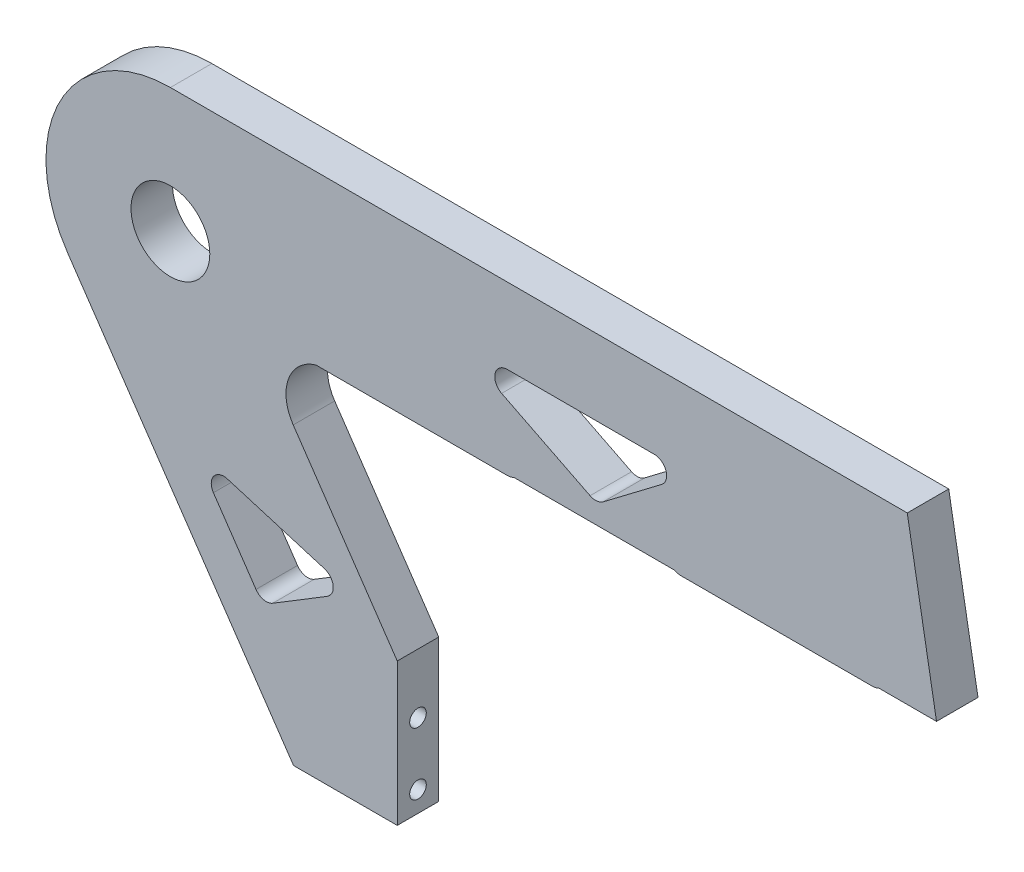
ISO-10303-21;
HEADER;
FILE_DESCRIPTION(('STEP AP214'),'2;1');
FILE_NAME('part.step','',(''),(''),'','','');
FILE_SCHEMA(('AUTOMOTIVE_DESIGN { 1 0 10303 214 1 1 1 1 }'));
ENDSEC;
DATA;
#1=APPLICATION_CONTEXT('core data for automotive mechanical design processes');
#2=APPLICATION_PROTOCOL_DEFINITION('international standard','automotive_design',2000,#1);
#3=PRODUCT_CONTEXT('',#1,'mechanical');
#4=PRODUCT('Part','Part','',(#3));
#5=PRODUCT_RELATED_PRODUCT_CATEGORY('part','',(#4));
#6=PRODUCT_DEFINITION_FORMATION('','',#4);
#7=PRODUCT_DEFINITION_CONTEXT('part definition',#1,'design');
#8=PRODUCT_DEFINITION('design','',#6,#7);
#9=PRODUCT_DEFINITION_SHAPE('','',#8);
#10=(LENGTH_UNIT() NAMED_UNIT(*) SI_UNIT(.MILLI.,.METRE.));
#11=(NAMED_UNIT(*) PLANE_ANGLE_UNIT() SI_UNIT($,.RADIAN.));
#12=(NAMED_UNIT(*) SI_UNIT($,.STERADIAN.) SOLID_ANGLE_UNIT());
#13=UNCERTAINTY_MEASURE_WITH_UNIT(LENGTH_MEASURE(1.E-05),#10,'distance_accuracy_value','');
#14=(GEOMETRIC_REPRESENTATION_CONTEXT(3) GLOBAL_UNCERTAINTY_ASSIGNED_CONTEXT((#13)) GLOBAL_UNIT_ASSIGNED_CONTEXT((#10,
#11,#12)) REPRESENTATION_CONTEXT('',''));
#15=CARTESIAN_POINT('',(0.,0.,0.));
#16=DIRECTION('',(0.,0.,1.));
#17=DIRECTION('',(1.,0.,0.));
#18=AXIS2_PLACEMENT_3D('',#15,#16,#17);
#19=CARTESIAN_POINT('',(26.6047172545659,86.3252414042962,5.));
#20=DIRECTION('',(0.,-1.,0.));
#21=DIRECTION('',(0.,0.,-1.));
#22=AXIS2_PLACEMENT_3D('',#19,#20,#21);
#23=PLANE('',#22);
#24=DIRECTION('',(-1.,0.,0.));
#25=VECTOR('',#24,1.);
#26=CARTESIAN_POINT('',(26.6047172545659,86.3252414042962,5.));
#27=LINE('',#26,#25);
#28=CARTESIAN_POINT('',(26.6047172545659,86.3252414042962,5.));
#29=VERTEX_POINT('',#28);
#30=CARTESIAN_POINT('',(-19.5793225067377,86.3252414042962,5.));
#31=VERTEX_POINT('',#30);
#32=EDGE_CURVE('E570',#29,#31,#27,.T.);
#33=ORIENTED_EDGE('',*,*,#32,.T.);
#34=DIRECTION('',(0.,0.,-1.));
#35=VECTOR('',#34,1.);
#36=CARTESIAN_POINT('',(-19.5793225067377,86.3252414042962,5.));
#37=LINE('',#36,#35);
#38=CARTESIAN_POINT('',(-19.5793225067377,86.3252414042962,-5.));
#39=VERTEX_POINT('',#38);
#40=EDGE_CURVE('E12',#31,#39,#37,.T.);
#41=ORIENTED_EDGE('',*,*,#40,.T.);
#42=DIRECTION('',(-1.,0.,0.));
#43=VECTOR('',#42,1.);
#44=CARTESIAN_POINT('',(26.6047172545659,86.3252414042962,-5.));
#45=LINE('',#44,#43);
#46=CARTESIAN_POINT('',(26.6047172545659,86.3252414042962,-5.));
#47=VERTEX_POINT('',#46);
#48=EDGE_CURVE('E337',#47,#39,#45,.T.);
#49=ORIENTED_EDGE('',*,*,#48,.F.);
#50=DIRECTION('',(0.,0.,-1.));
#51=VECTOR('',#50,1.);
#52=CARTESIAN_POINT('',(26.6047172545659,86.3252414042962,5.));
#53=LINE('',#52,#51);
#54=EDGE_CURVE('E395',#29,#47,#53,.T.);
#55=ORIENTED_EDGE('',*,*,#54,.F.);
#56=EDGE_LOOP('',(#33,#41,#49,#55));
#57=FACE_BOUND('',#56,.T.);
#58=ADVANCED_FACE('F280',(#57),#23,.T.);
#59=CARTESIAN_POINT('',(26.6047172545659,89.3252414042961,5.));
#60=DIRECTION('',(0.,0.,-1.));
#61=DIRECTION('',(-1.,0.,0.));
#62=AXIS2_PLACEMENT_3D('',#59,#60,#61);
#63=CYLINDRICAL_SURFACE('',#62,2.99999999999997);
#64=CARTESIAN_POINT('',(26.6047172545659,89.3252414042961,-5.));
#65=DIRECTION('',(0.,0.,-1.));
#66=DIRECTION('',(-1.,0.,0.));
#67=AXIS2_PLACEMENT_3D('',#64,#65,#66);
#68=CIRCLE('',#67,2.99999999999997);
#69=CARTESIAN_POINT('',(28.0795884291685,86.7128181961757,-5.));
#70=VERTEX_POINT('',#69);
#71=EDGE_CURVE('E573',#70,#47,#68,.T.);
#72=ORIENTED_EDGE('',*,*,#71,.F.);
#73=DIRECTION('',(0.,0.,-1.));
#74=VECTOR('',#73,1.);
#75=CARTESIAN_POINT('',(28.0795884291685,86.7128181961757,5.));
#76=LINE('',#75,#74);
#77=CARTESIAN_POINT('',(28.0795884291685,86.7128181961757,5.));
#78=VERTEX_POINT('',#77);
#79=EDGE_CURVE('E290',#70,#78,#76,.F.);
#80=ORIENTED_EDGE('',*,*,#79,.T.);
#81=CARTESIAN_POINT('',(26.6047172545659,89.3252414042961,5.));
#82=DIRECTION('',(0.,0.,-1.));
#83=DIRECTION('',(-1.,0.,0.));
#84=AXIS2_PLACEMENT_3D('',#81,#82,#83);
#85=CIRCLE('',#84,2.99999999999997);
#86=EDGE_CURVE('E572',#78,#29,#85,.T.);
#87=ORIENTED_EDGE('',*,*,#86,.T.);
#88=ORIENTED_EDGE('',*,*,#54,.T.);
#89=EDGE_LOOP('',(#72,#80,#87,#88));
#90=FACE_BOUND('',#89,.T.);
#91=ADVANCED_FACE('F734',(#90),#63,.T.);
#92=CARTESIAN_POINT('',(114.623497212367,86.3252414042962,5.));
#93=DIRECTION('',(0.,-1.,0.));
#94=DIRECTION('',(0.,0.,-1.));
#95=AXIS2_PLACEMENT_3D('',#92,#93,#94);
#96=PLANE('',#95);
#97=DIRECTION('',(-1.,0.,0.));
#98=VECTOR('',#97,1.);
#99=CARTESIAN_POINT('',(114.623497212367,86.3252414042962,-5.));
#100=LINE('',#99,#98);
#101=CARTESIAN_POINT('',(114.623497212367,86.3252414042962,-5.));
#102=VERTEX_POINT('',#101);
#103=CARTESIAN_POINT('',(68.3535915441412,86.3252414042962,-5.));
#104=VERTEX_POINT('',#103);
#105=EDGE_CURVE('E331',#102,#104,#100,.T.);
#106=ORIENTED_EDGE('',*,*,#105,.F.);
#107=DIRECTION('',(0.,0.,-1.));
#108=VECTOR('',#107,1.);
#109=CARTESIAN_POINT('',(114.623497212367,86.3252414042962,5.));
#110=LINE('',#109,#108);
#111=CARTESIAN_POINT('',(114.623497212367,86.3252414042962,5.));
#112=VERTEX_POINT('',#111);
#113=EDGE_CURVE('E338',#112,#102,#110,.T.);
#114=ORIENTED_EDGE('',*,*,#113,.F.);
#115=DIRECTION('',(-1.,0.,0.));
#116=VECTOR('',#115,1.);
#117=CARTESIAN_POINT('',(114.623497212367,86.3252414042962,5.));
#118=LINE('',#117,#116);
#119=CARTESIAN_POINT('',(68.3535915441412,86.3252414042962,5.));
#120=VERTEX_POINT('',#119);
#121=EDGE_CURVE('E333',#112,#120,#118,.T.);
#122=ORIENTED_EDGE('',*,*,#121,.T.);
#123=DIRECTION('',(0.,0.,-1.));
#124=VECTOR('',#123,1.);
#125=CARTESIAN_POINT('',(68.3535915441412,86.3252414042962,5.));
#126=LINE('',#125,#124);
#127=EDGE_CURVE('E327',#120,#104,#126,.T.);
#128=ORIENTED_EDGE('',*,*,#127,.T.);
#129=EDGE_LOOP('',(#106,#114,#122,#128));
#130=FACE_BOUND('',#129,.T.);
#131=ADVANCED_FACE('F329',(#130),#96,.T.);
#132=CARTESIAN_POINT('',(114.623497212367,89.3252414042962,5.));
#133=DIRECTION('',(0.,0.,-1.));
#134=DIRECTION('',(-1.,0.,0.));
#135=AXIS2_PLACEMENT_3D('',#132,#133,#134);
#136=CYLINDRICAL_SURFACE('',#135,3.);
#137=CARTESIAN_POINT('',(114.623497212367,89.3252414042962,-5.));
#138=DIRECTION('',(0.,0.,-1.));
#139=DIRECTION('',(-1.,0.,0.));
#140=AXIS2_PLACEMENT_3D('',#137,#138,#139);
#141=CIRCLE('',#140,3.);
#142=CARTESIAN_POINT('',(116.09836838697,86.7128181961757,-5.));
#143=VERTEX_POINT('',#142);
#144=EDGE_CURVE('E321',#143,#102,#141,.T.);
#145=ORIENTED_EDGE('',*,*,#144,.F.);
#146=DIRECTION('',(0.,0.,-1.));
#147=VECTOR('',#146,1.);
#148=CARTESIAN_POINT('',(116.09836838697,86.7128181961757,5.));
#149=LINE('',#148,#147);
#150=CARTESIAN_POINT('',(116.09836838697,86.7128181961757,5.));
#151=VERTEX_POINT('',#150);
#152=EDGE_CURVE('E544',#143,#151,#149,.F.);
#153=ORIENTED_EDGE('',*,*,#152,.T.);
#154=CARTESIAN_POINT('',(114.623497212367,89.3252414042962,5.));
#155=DIRECTION('',(0.,0.,-1.));
#156=DIRECTION('',(-1.,0.,0.));
#157=AXIS2_PLACEMENT_3D('',#154,#155,#156);
#158=CIRCLE('',#157,3.);
#159=EDGE_CURVE('E354',#151,#112,#158,.T.);
#160=ORIENTED_EDGE('',*,*,#159,.T.);
#161=ORIENTED_EDGE('',*,*,#113,.T.);
#162=EDGE_LOOP('',(#145,#153,#160,#161));
#163=FACE_BOUND('',#162,.T.);
#164=ADVANCED_FACE('F583',(#163),#136,.T.);
#165=CARTESIAN_POINT('',(68.3535915441412,89.3252414042962,5.));
#166=DIRECTION('',(0.,0.,-1.));
#167=DIRECTION('',(-1.,0.,0.));
#168=AXIS2_PLACEMENT_3D('',#165,#166,#167);
#169=CYLINDRICAL_SURFACE('',#168,3.);
#170=CARTESIAN_POINT('',(68.3535915441412,89.3252414042962,5.));
#171=DIRECTION('',(0.,0.,-1.));
#172=DIRECTION('',(-1.,0.,0.));
#173=AXIS2_PLACEMENT_3D('',#170,#171,#172);
#174=CIRCLE('',#173,3.);
#175=CARTESIAN_POINT('',(66.8787203695385,86.7128181961757,5.));
#176=VERTEX_POINT('',#175);
#177=EDGE_CURVE('E352',#120,#176,#174,.T.);
#178=ORIENTED_EDGE('',*,*,#177,.T.);
#179=DIRECTION('',(0.,0.,-1.));
#180=VECTOR('',#179,1.);
#181=CARTESIAN_POINT('',(66.8787203695385,86.7128181961757,5.));
#182=LINE('',#181,#180);
#183=CARTESIAN_POINT('',(66.8787203695385,86.7128181961757,-5.));
#184=VERTEX_POINT('',#183);
#185=EDGE_CURVE('E345',#176,#184,#182,.T.);
#186=ORIENTED_EDGE('',*,*,#185,.T.);
#187=CARTESIAN_POINT('',(68.3535915441412,89.3252414042962,-5.));
#188=DIRECTION('',(0.,0.,-1.));
#189=DIRECTION('',(-1.,0.,0.));
#190=AXIS2_PLACEMENT_3D('',#187,#188,#189);
#191=CIRCLE('',#190,3.);
#192=EDGE_CURVE('E342',#104,#184,#191,.T.);
#193=ORIENTED_EDGE('',*,*,#192,.F.);
#194=ORIENTED_EDGE('',*,*,#127,.F.);
#195=EDGE_LOOP('',(#178,#186,#193,#194));
#196=FACE_BOUND('',#195,.T.);
#197=ADVANCED_FACE('F282',(#196),#169,.T.);
#198=CARTESIAN_POINT('',(-31.570335154587,33.9417913308013,5.));
#199=DIRECTION('',(0.,0.,-1.));
#200=DIRECTION('',(-1.,0.,0.));
#201=AXIS2_PLACEMENT_3D('',#198,#199,#200);
#202=CYLINDRICAL_SURFACE('',#201,2.99999999999999);
#203=CARTESIAN_POINT('',(-31.570335154587,33.9417913308013,-5.));
#204=DIRECTION('',(0.,0.,1.));
#205=DIRECTION('',(1.,0.,0.));
#206=AXIS2_PLACEMENT_3D('',#203,#204,#205);
#207=CIRCLE('',#206,2.99999999999999);
#208=CARTESIAN_POINT('',(-34.04820636073,32.2505922633443,-5.));
#209=VERTEX_POINT('',#208);
#210=CARTESIAN_POINT('',(-30.0092889753777,31.3799297368865,-5.));
#211=VERTEX_POINT('',#210);
#212=EDGE_CURVE('E458',#209,#211,#207,.T.);
#213=ORIENTED_EDGE('',*,*,#212,.F.);
#214=DIRECTION('',(0.,0.,-1.));
#215=VECTOR('',#214,1.);
#216=CARTESIAN_POINT('',(-34.04820636073,32.2505922633443,5.));
#217=LINE('',#216,#215);
#218=CARTESIAN_POINT('',(-34.04820636073,32.2505922633443,5.));
#219=VERTEX_POINT('',#218);
#220=EDGE_CURVE('E468',#219,#209,#217,.T.);
#221=ORIENTED_EDGE('',*,*,#220,.F.);
#222=CARTESIAN_POINT('',(-31.570335154587,33.9417913308013,5.));
#223=DIRECTION('',(0.,0.,1.));
#224=DIRECTION('',(1.,0.,0.));
#225=AXIS2_PLACEMENT_3D('',#222,#223,#224);
#226=CIRCLE('',#225,2.99999999999999);
#227=CARTESIAN_POINT('',(-30.0092889753777,31.3799297368865,5.));
#228=VERTEX_POINT('',#227);
#229=EDGE_CURVE('E440',#219,#228,#226,.T.);
#230=ORIENTED_EDGE('',*,*,#229,.T.);
#231=DIRECTION('',(0.,0.,-1.));
#232=VECTOR('',#231,1.);
#233=CARTESIAN_POINT('',(-30.0092889753777,31.3799297368865,5.));
#234=LINE('',#233,#232);
#235=EDGE_CURVE('E465',#228,#211,#234,.T.);
#236=ORIENTED_EDGE('',*,*,#235,.T.);
#237=EDGE_LOOP('',(#213,#221,#230,#236));
#238=FACE_BOUND('',#237,.T.);
#239=ADVANCED_FACE('F749',(#238),#202,.F.);
#240=CARTESIAN_POINT('',(-44.3201361267429,47.3005763181477,5.));
#241=DIRECTION('',(0.825957068714329,0.563733022485675,0.));
#242=DIRECTION('',(-0.563733022485675,0.825957068714329,0.));
#243=AXIS2_PLACEMENT_3D('',#240,#241,#242);
#244=PLANE('',#243);
#245=DIRECTION('',(0.563733022485675,-0.825957068714329,0.));
#246=VECTOR('',#245,1.);
#247=CARTESIAN_POINT('',(-44.3201361267429,47.3005763181477,-5.));
#248=LINE('',#247,#246);
#249=CARTESIAN_POINT('',(-44.3201361267429,47.3005763181477,-5.));
#250=VERTEX_POINT('',#249);
#251=EDGE_CURVE('E455',#250,#209,#248,.T.);
#252=ORIENTED_EDGE('',*,*,#251,.F.);
#253=DIRECTION('',(0.,0.,-1.));
#254=VECTOR('',#253,1.);
#255=CARTESIAN_POINT('',(-44.3201361267429,47.3005763181477,5.));
#256=LINE('',#255,#254);
#257=CARTESIAN_POINT('',(-44.3201361267429,47.3005763181477,5.));
#258=VERTEX_POINT('',#257);
#259=EDGE_CURVE('E471',#258,#250,#256,.T.);
#260=ORIENTED_EDGE('',*,*,#259,.F.);
#261=DIRECTION('',(0.563733022485675,-0.825957068714329,0.));
#262=VECTOR('',#261,1.);
#263=CARTESIAN_POINT('',(-44.3201361267429,47.3005763181477,5.));
#264=LINE('',#263,#262);
#265=EDGE_CURVE('E437',#258,#219,#264,.T.);
#266=ORIENTED_EDGE('',*,*,#265,.T.);
#267=ORIENTED_EDGE('',*,*,#220,.T.);
#268=EDGE_LOOP('',(#252,#260,#266,#267));
#269=FACE_BOUND('',#268,.T.);
#270=ADVANCED_FACE('F753',(#269),#244,.T.);
#271=CARTESIAN_POINT('',(-41.8422649206,48.9917753856047,5.));
#272=DIRECTION('',(0.,0.,-1.));
#273=DIRECTION('',(-1.,0.,0.));
#274=AXIS2_PLACEMENT_3D('',#271,#272,#273);
#275=CYLINDRICAL_SURFACE('',#274,2.99999999999999);
#276=CARTESIAN_POINT('',(-41.8422649206,48.9917753856047,-5.));
#277=DIRECTION('',(0.,0.,-1.));
#278=DIRECTION('',(-1.,0.,0.));
#279=AXIS2_PLACEMENT_3D('',#276,#277,#278);
#280=CIRCLE('',#279,2.99999999999999);
#281=CARTESIAN_POINT('',(-40.9783964877711,51.8647061767589,-5.));
#282=VERTEX_POINT('',#281);
#283=EDGE_CURVE('E452',#250,#282,#280,.T.);
#284=ORIENTED_EDGE('',*,*,#283,.T.);
#285=DIRECTION('',(0.,0.,-1.));
#286=VECTOR('',#285,1.);
#287=CARTESIAN_POINT('',(-40.9783964877711,51.8647061767589,5.));
#288=LINE('',#287,#286);
#289=CARTESIAN_POINT('',(-40.9783964877711,51.8647061767589,5.));
#290=VERTEX_POINT('',#289);
#291=EDGE_CURVE('E474',#290,#282,#288,.T.);
#292=ORIENTED_EDGE('',*,*,#291,.F.);
#293=CARTESIAN_POINT('',(-41.8422649206,48.9917753856047,5.));
#294=DIRECTION('',(0.,0.,-1.));
#295=DIRECTION('',(-1.,0.,0.));
#296=AXIS2_PLACEMENT_3D('',#293,#294,#295);
#297=CIRCLE('',#296,2.99999999999999);
#298=EDGE_CURVE('E434',#258,#290,#297,.T.);
#299=ORIENTED_EDGE('',*,*,#298,.F.);
#300=ORIENTED_EDGE('',*,*,#259,.T.);
#301=EDGE_LOOP('',(#284,#292,#299,#300));
#302=FACE_BOUND('',#301,.T.);
#303=ADVANCED_FACE('F759',(#302),#275,.F.);
#304=CARTESIAN_POINT('',(-17.562664750331,44.8237737805291,5.));
#305=DIRECTION('',(-0.287956144276289,-0.957643597051394,0.));
#306=DIRECTION('',(0.957643597051394,-0.287956144276289,0.));
#307=AXIS2_PLACEMENT_3D('',#304,#305,#306);
#308=PLANE('',#307);
#309=DIRECTION('',(-0.957643597051394,0.287956144276289,0.));
#310=VECTOR('',#309,1.);
#311=CARTESIAN_POINT('',(-17.562664750331,44.8237737805291,-5.));
#312=LINE('',#311,#310);
#313=CARTESIAN_POINT('',(-17.562664750331,44.8237737805291,-5.));
#314=VERTEX_POINT('',#313);
#315=EDGE_CURVE('E449',#314,#282,#312,.T.);
#316=ORIENTED_EDGE('',*,*,#315,.F.);
#317=DIRECTION('',(0.,0.,-1.));
#318=VECTOR('',#317,1.);
#319=CARTESIAN_POINT('',(-17.562664750331,44.8237737805291,5.));
#320=LINE('',#319,#318);
#321=CARTESIAN_POINT('',(-17.562664750331,44.8237737805291,5.));
#322=VERTEX_POINT('',#321);
#323=EDGE_CURVE('E477',#322,#314,#320,.T.);
#324=ORIENTED_EDGE('',*,*,#323,.F.);
#325=DIRECTION('',(-0.957643597051394,0.287956144276289,0.));
#326=VECTOR('',#325,1.);
#327=CARTESIAN_POINT('',(-17.562664750331,44.8237737805291,5.));
#328=LINE('',#327,#326);
#329=EDGE_CURVE('E430',#322,#290,#328,.T.);
#330=ORIENTED_EDGE('',*,*,#329,.T.);
#331=ORIENTED_EDGE('',*,*,#291,.T.);
#332=EDGE_LOOP('',(#316,#324,#330,#331));
#333=FACE_BOUND('',#332,.T.);
#334=ADVANCED_FACE('F769',(#333),#308,.T.);
#335=CARTESIAN_POINT('',(-18.4265331831598,41.9508429893749,5.));
#336=DIRECTION('',(0.,0.,-1.));
#337=DIRECTION('',(-1.,0.,0.));
#338=AXIS2_PLACEMENT_3D('',#335,#336,#337);
#339=CYLINDRICAL_SURFACE('',#338,2.99999999999999);
#340=CARTESIAN_POINT('',(-18.4265331831598,41.9508429893749,-5.));
#341=DIRECTION('',(0.,0.,1.));
#342=DIRECTION('',(1.,0.,0.));
#343=AXIS2_PLACEMENT_3D('',#340,#341,#342);
#344=CIRCLE('',#343,2.99999999999999);
#345=CARTESIAN_POINT('',(-16.8654870039506,39.3889813954601,-5.));
#346=VERTEX_POINT('',#345);
#347=EDGE_CURVE('E412',#346,#314,#344,.T.);
#348=ORIENTED_EDGE('',*,*,#347,.F.);
#349=DIRECTION('',(0.,0.,-1.));
#350=VECTOR('',#349,1.);
#351=CARTESIAN_POINT('',(-16.8654870039506,39.3889813954601,5.));
#352=LINE('',#351,#350);
#353=CARTESIAN_POINT('',(-16.8654870039506,39.3889813954601,5.));
#354=VERTEX_POINT('',#353);
#355=EDGE_CURVE('E446',#354,#346,#352,.T.);
#356=ORIENTED_EDGE('',*,*,#355,.F.);
#357=CARTESIAN_POINT('',(-18.4265331831598,41.9508429893749,5.));
#358=DIRECTION('',(0.,0.,1.));
#359=DIRECTION('',(1.,0.,0.));
#360=AXIS2_PLACEMENT_3D('',#357,#358,#359);
#361=CIRCLE('',#360,2.99999999999999);
#362=EDGE_CURVE('E427',#354,#322,#361,.T.);
#363=ORIENTED_EDGE('',*,*,#362,.T.);
#364=ORIENTED_EDGE('',*,*,#323,.T.);
#365=EDGE_LOOP('',(#348,#356,#363,#364));
#366=FACE_BOUND('',#365,.T.);
#367=ADVANCED_FACE('F773',(#366),#339,.F.);
#368=CARTESIAN_POINT('',(-30.0092889753777,31.3799297368865,5.));
#369=DIRECTION('',(-0.520348726403097,0.853953864638292,0.));
#370=DIRECTION('',(-0.853953864638292,-0.520348726403097,0.));
#371=AXIS2_PLACEMENT_3D('',#368,#369,#370);
#372=PLANE('',#371);
#373=DIRECTION('',(0.853953864638292,0.520348726403097,0.));
#374=VECTOR('',#373,1.);
#375=CARTESIAN_POINT('',(-30.0092889753777,31.3799297368865,-5.));
#376=LINE('',#375,#374);
#377=EDGE_CURVE('E431',#211,#346,#376,.T.);
#378=ORIENTED_EDGE('',*,*,#377,.F.);
#379=ORIENTED_EDGE('',*,*,#235,.F.);
#380=DIRECTION('',(0.853953864638292,0.520348726403097,0.));
#381=VECTOR('',#380,1.);
#382=CARTESIAN_POINT('',(-30.0092889753777,31.3799297368865,5.));
#383=LINE('',#382,#381);
#384=EDGE_CURVE('E443',#228,#354,#383,.T.);
#385=ORIENTED_EDGE('',*,*,#384,.T.);
#386=ORIENTED_EDGE('',*,*,#355,.T.);
#387=EDGE_LOOP('',(#378,#379,#385,#386));
#388=FACE_BOUND('',#387,.T.);
#389=ADVANCED_FACE('F764',(#388),#372,.T.);
#390=CARTESIAN_POINT('',(-54.6870264128926,96.7128181961757,5.));
#391=DIRECTION('',(0.,0.,-1.));
#392=DIRECTION('',(-1.,0.,0.));
#393=AXIS2_PLACEMENT_3D('',#390,#391,#392);
#394=CYLINDRICAL_SURFACE('',#393,9.50000000000001);
#395=CARTESIAN_POINT('',(-54.6870264128926,96.7128181961757,5.));
#396=DIRECTION('',(0.,0.,1.));
#397=DIRECTION('',(1.,0.,0.));
#398=AXIS2_PLACEMENT_3D('',#395,#396,#397);
#399=CIRCLE('',#398,9.50000000000001);
#400=CARTESIAN_POINT('',(-45.1870264128926,96.7128181961757,5.));
#401=VERTEX_POINT('',#400);
#402=EDGE_CURVE('E481',#401,#401,#399,.T.);
#403=ORIENTED_EDGE('',*,*,#402,.T.);
#404=EDGE_LOOP('',(#403));
#405=FACE_BOUND('',#404,.T.);
#406=CARTESIAN_POINT('',(-54.6870264128926,96.7128181961757,-5.));
#407=DIRECTION('',(0.,0.,1.));
#408=DIRECTION('',(1.,0.,0.));
#409=AXIS2_PLACEMENT_3D('',#406,#407,#408);
#410=CIRCLE('',#409,9.50000000000001);
#411=CARTESIAN_POINT('',(-45.1870264128926,96.7128181961757,-5.));
#412=VERTEX_POINT('',#411);
#413=EDGE_CURVE('E480',#412,#412,#410,.T.);
#414=ORIENTED_EDGE('',*,*,#413,.F.);
#415=EDGE_LOOP('',(#414));
#416=FACE_BOUND('',#415,.T.);
#417=ADVANCED_FACE('F778',(#405,#416),#394,.F.);
#418=CARTESIAN_POINT('',(46.4802926947495,92.0811795731184,5.));
#419=DIRECTION('',(-0.448484395141479,-0.893790661908359,0.));
#420=DIRECTION('',(0.893790661908359,-0.448484395141479,0.));
#421=AXIS2_PLACEMENT_3D('',#418,#419,#420);
#422=PLANE('',#421);
#423=DIRECTION('',(-0.893790661908359,0.448484395141479,0.));
#424=VECTOR('',#423,1.);
#425=CARTESIAN_POINT('',(46.4802926947495,92.0811795731184,-5.));
#426=LINE('',#425,#424);
#427=CARTESIAN_POINT('',(46.4802926947495,92.0811795731184,-5.));
#428=VERTEX_POINT('',#427);
#429=CARTESIAN_POINT('',(25.1602319501235,102.77911473281,-5.));
#430=VERTEX_POINT('',#429);
#431=EDGE_CURVE('E394',#428,#430,#426,.T.);
#432=ORIENTED_EDGE('',*,*,#431,.T.);
#433=DIRECTION('',(0.,0.,-1.));
#434=VECTOR('',#433,1.);
#435=CARTESIAN_POINT('',(25.1602319501235,102.77911473281,5.));
#436=LINE('',#435,#434);
#437=CARTESIAN_POINT('',(25.1602319501235,102.77911473281,5.));
#438=VERTEX_POINT('',#437);
#439=EDGE_CURVE('E422',#438,#430,#436,.T.);
#440=ORIENTED_EDGE('',*,*,#439,.F.);
#441=DIRECTION('',(-0.893790661908359,0.448484395141479,0.));
#442=VECTOR('',#441,1.);
#443=CARTESIAN_POINT('',(46.4802926947495,92.0811795731184,5.));
#444=LINE('',#443,#442);
#445=CARTESIAN_POINT('',(46.4802926947495,92.0811795731184,5.));
#446=VERTEX_POINT('',#445);
#447=EDGE_CURVE('E374',#446,#438,#444,.T.);
#448=ORIENTED_EDGE('',*,*,#447,.F.);
#449=DIRECTION('',(0.,0.,-1.));
#450=VECTOR('',#449,1.);
#451=CARTESIAN_POINT('',(46.4802926947495,92.0811795731184,5.));
#452=LINE('',#451,#450);
#453=EDGE_CURVE('E390',#446,#428,#452,.T.);
#454=ORIENTED_EDGE('',*,*,#453,.T.);
#455=EDGE_LOOP('',(#432,#440,#448,#454));
#456=FACE_BOUND('',#455,.T.);
#457=ADVANCED_FACE('F706',(#456),#422,.F.);
#458=CARTESIAN_POINT('',(26.505685135548,105.460486718535,5.));
#459=DIRECTION('',(0.,0.,-1.));
#460=DIRECTION('',(-1.,0.,0.));
#461=AXIS2_PLACEMENT_3D('',#458,#459,#460);
#462=CYLINDRICAL_SURFACE('',#461,3.);
#463=CARTESIAN_POINT('',(26.505685135548,105.460486718535,-5.));
#464=DIRECTION('',(0.,0.,1.));
#465=DIRECTION('',(1.,0.,0.));
#466=AXIS2_PLACEMENT_3D('',#463,#464,#465);
#467=CIRCLE('',#466,3.);
#468=CARTESIAN_POINT('',(26.505685135548,108.460486718535,-5.));
#469=VERTEX_POINT('',#468);
#470=EDGE_CURVE('E398',#469,#430,#467,.T.);
#471=ORIENTED_EDGE('',*,*,#470,.F.);
#472=DIRECTION('',(0.,0.,-1.));
#473=VECTOR('',#472,1.);
#474=CARTESIAN_POINT('',(26.505685135548,108.460486718535,5.));
#475=LINE('',#474,#473);
#476=CARTESIAN_POINT('',(26.505685135548,108.460486718535,5.));
#477=VERTEX_POINT('',#476);
#478=EDGE_CURVE('E419',#477,#469,#475,.T.);
#479=ORIENTED_EDGE('',*,*,#478,.F.);
#480=CARTESIAN_POINT('',(26.505685135548,105.460486718535,5.));
#481=DIRECTION('',(0.,0.,1.));
#482=DIRECTION('',(1.,0.,0.));
#483=AXIS2_PLACEMENT_3D('',#480,#481,#482);
#484=CIRCLE('',#483,3.);
#485=EDGE_CURVE('E378',#477,#438,#484,.T.);
#486=ORIENTED_EDGE('',*,*,#485,.T.);
#487=ORIENTED_EDGE('',*,*,#439,.T.);
#488=EDGE_LOOP('',(#471,#479,#486,#487));
#489=FACE_BOUND('',#488,.T.);
#490=ADVANCED_FACE('F719',(#489),#462,.F.);
#491=CARTESIAN_POINT('',(26.505685135548,108.460486718535,5.));
#492=DIRECTION('',(0.,1.,0.));
#493=DIRECTION('',(0.,0.,1.));
#494=AXIS2_PLACEMENT_3D('',#491,#492,#493);
#495=PLANE('',#494);
#496=DIRECTION('',(1.,0.,0.));
#497=VECTOR('',#496,1.);
#498=CARTESIAN_POINT('',(26.505685135548,108.460486718535,-5.));
#499=LINE('',#498,#497);
#500=CARTESIAN_POINT('',(61.9454963051726,108.460486718535,-5.));
#501=VERTEX_POINT('',#500);
#502=EDGE_CURVE('E401',#469,#501,#499,.T.);
#503=ORIENTED_EDGE('',*,*,#502,.T.);
#504=DIRECTION('',(0.,0.,-1.));
#505=VECTOR('',#504,1.);
#506=CARTESIAN_POINT('',(61.9454963051726,108.460486718535,5.));
#507=LINE('',#506,#505);
#508=CARTESIAN_POINT('',(61.9454963051726,108.460486718535,5.));
#509=VERTEX_POINT('',#508);
#510=EDGE_CURVE('E416',#509,#501,#507,.T.);
#511=ORIENTED_EDGE('',*,*,#510,.F.);
#512=DIRECTION('',(1.,0.,0.));
#513=VECTOR('',#512,1.);
#514=CARTESIAN_POINT('',(26.505685135548,108.460486718535,5.));
#515=LINE('',#514,#513);
#516=EDGE_CURVE('E381',#477,#509,#515,.T.);
#517=ORIENTED_EDGE('',*,*,#516,.F.);
#518=ORIENTED_EDGE('',*,*,#478,.T.);
#519=EDGE_LOOP('',(#503,#511,#517,#518));
#520=FACE_BOUND('',#519,.T.);
#521=ADVANCED_FACE('F722',(#520),#495,.F.);
#522=CARTESIAN_POINT('',(61.9454963051726,105.460486718535,5.));
#523=DIRECTION('',(0.,0.,-1.));
#524=DIRECTION('',(-1.,0.,0.));
#525=AXIS2_PLACEMENT_3D('',#522,#523,#524);
#526=CYLINDRICAL_SURFACE('',#525,3.);
#527=CARTESIAN_POINT('',(61.9454963051726,105.460486718535,-5.));
#528=DIRECTION('',(0.,0.,-1.));
#529=DIRECTION('',(-1.,0.,0.));
#530=AXIS2_PLACEMENT_3D('',#527,#528,#529);
#531=CIRCLE('',#530,3.);
#532=CARTESIAN_POINT('',(63.7571935919196,103.069304387303,-5.));
#533=VERTEX_POINT('',#532);
#534=EDGE_CURVE('E404',#501,#533,#531,.T.);
#535=ORIENTED_EDGE('',*,*,#534,.T.);
#536=DIRECTION('',(0.,0.,-1.));
#537=VECTOR('',#536,1.);
#538=CARTESIAN_POINT('',(63.7571935919196,103.069304387303,5.));
#539=LINE('',#538,#537);
#540=CARTESIAN_POINT('',(63.7571935919196,103.069304387303,5.));
#541=VERTEX_POINT('',#540);
#542=EDGE_CURVE('E413',#541,#533,#539,.T.);
#543=ORIENTED_EDGE('',*,*,#542,.F.);
#544=CARTESIAN_POINT('',(61.9454963051726,105.460486718535,5.));
#545=DIRECTION('',(0.,0.,-1.));
#546=DIRECTION('',(-1.,0.,0.));
#547=AXIS2_PLACEMENT_3D('',#544,#545,#546);
#548=CIRCLE('',#547,3.);
#549=EDGE_CURVE('E384',#509,#541,#548,.T.);
#550=ORIENTED_EDGE('',*,*,#549,.F.);
#551=ORIENTED_EDGE('',*,*,#510,.T.);
#552=EDGE_LOOP('',(#535,#543,#550,#551));
#553=FACE_BOUND('',#552,.T.);
#554=ADVANCED_FACE('F724',(#553),#526,.F.);
#555=CARTESIAN_POINT('',(63.7571935919196,103.069304387303,5.));
#556=DIRECTION('',(0.603899095582316,-0.79706077707717,0.));
#557=DIRECTION('',(0.79706077707717,0.603899095582316,0.));
#558=AXIS2_PLACEMENT_3D('',#555,#556,#557);
#559=PLANE('',#558);
#560=DIRECTION('',(-0.797060777077169,-0.603899095582316,0.));
#561=VECTOR('',#560,1.);
#562=CARTESIAN_POINT('',(63.7571935919196,103.069304387303,-5.));
#563=LINE('',#562,#561);
#564=CARTESIAN_POINT('',(49.6374431669209,92.371369227612,-5.));
#565=VERTEX_POINT('',#564);
#566=EDGE_CURVE('E375',#533,#565,#563,.T.);
#567=ORIENTED_EDGE('',*,*,#566,.T.);
#568=DIRECTION('',(0.,0.,-1.));
#569=VECTOR('',#568,1.);
#570=CARTESIAN_POINT('',(49.6374431669209,92.371369227612,5.));
#571=LINE('',#570,#569);
#572=CARTESIAN_POINT('',(49.6374431669209,92.371369227612,5.));
#573=VERTEX_POINT('',#572);
#574=EDGE_CURVE('E409',#573,#565,#571,.T.);
#575=ORIENTED_EDGE('',*,*,#574,.F.);
#576=DIRECTION('',(-0.797060777077169,-0.603899095582316,0.));
#577=VECTOR('',#576,1.);
#578=CARTESIAN_POINT('',(63.7571935919196,103.069304387303,5.));
#579=LINE('',#578,#577);
#580=EDGE_CURVE('E387',#541,#573,#579,.T.);
#581=ORIENTED_EDGE('',*,*,#580,.F.);
#582=ORIENTED_EDGE('',*,*,#542,.T.);
#583=EDGE_LOOP('',(#567,#575,#581,#582));
#584=FACE_BOUND('',#583,.T.);
#585=ADVANCED_FACE('F712',(#584),#559,.F.);
#586=CARTESIAN_POINT('',(47.825745880174,94.7625515588435,5.));
#587=DIRECTION('',(0.,0.,-1.));
#588=DIRECTION('',(-1.,0.,0.));
#589=AXIS2_PLACEMENT_3D('',#586,#587,#588);
#590=CYLINDRICAL_SURFACE('',#589,3.00000000000001);
#591=CARTESIAN_POINT('',(47.825745880174,94.7625515588435,-5.));
#592=DIRECTION('',(0.,0.,-1.));
#593=DIRECTION('',(-1.,0.,0.));
#594=AXIS2_PLACEMENT_3D('',#591,#592,#593);
#595=CIRCLE('',#594,3.00000000000001);
#596=EDGE_CURVE('E391',#565,#428,#595,.T.);
#597=ORIENTED_EDGE('',*,*,#596,.T.);
#598=ORIENTED_EDGE('',*,*,#453,.F.);
#599=CARTESIAN_POINT('',(47.825745880174,94.7625515588435,5.));
#600=DIRECTION('',(0.,0.,-1.));
#601=DIRECTION('',(-1.,0.,0.));
#602=AXIS2_PLACEMENT_3D('',#599,#600,#601);
#603=CIRCLE('',#602,3.00000000000001);
#604=EDGE_CURVE('E371',#573,#446,#603,.T.);
#605=ORIENTED_EDGE('',*,*,#604,.F.);
#606=ORIENTED_EDGE('',*,*,#574,.T.);
#607=EDGE_LOOP('',(#597,#598,#605,#606));
#608=FACE_BOUND('',#607,.T.);
#609=ADVANCED_FACE('F702',(#608),#590,.F.);
#610=CARTESIAN_POINT('',(-54.6870264128926,126.712818196176,5.));
#611=DIRECTION('',(0.,1.,0.));
#612=DIRECTION('',(0.,0.,1.));
#613=AXIS2_PLACEMENT_3D('',#610,#611,#612);
#614=PLANE('',#613);
#615=DIRECTION('',(1.,0.,0.));
#616=VECTOR('',#615,1.);
#617=CARTESIAN_POINT('',(-54.6870264128926,126.712818196176,-5.));
#618=LINE('',#617,#616);
#619=CARTESIAN_POINT('',(-54.6870264128926,126.712818196176,-5.));
#620=VERTEX_POINT('',#619);
#621=CARTESIAN_POINT('',(122.946920771661,126.712818196176,-5.));
#622=VERTEX_POINT('',#621);
#623=EDGE_CURVE('E530',#620,#622,#618,.T.);
#624=ORIENTED_EDGE('',*,*,#623,.F.);
#625=DIRECTION('',(0.,0.,-1.));
#626=VECTOR('',#625,1.);
#627=CARTESIAN_POINT('',(-54.6870264128926,126.712818196176,5.));
#628=LINE('',#627,#626);
#629=CARTESIAN_POINT('',(-54.6870264128926,126.712818196176,5.));
#630=VERTEX_POINT('',#629);
#631=EDGE_CURVE('E551',#630,#620,#628,.T.);
#632=ORIENTED_EDGE('',*,*,#631,.F.);
#633=DIRECTION('',(1.,0.,0.));
#634=VECTOR('',#633,1.);
#635=CARTESIAN_POINT('',(-54.6870264128926,126.712818196176,5.));
#636=LINE('',#635,#634);
#637=CARTESIAN_POINT('',(122.946920771661,126.712818196176,5.));
#638=VERTEX_POINT('',#637);
#639=EDGE_CURVE('E503',#630,#638,#636,.T.);
#640=ORIENTED_EDGE('',*,*,#639,.T.);
#641=DIRECTION('',(0.,0.,-1.));
#642=VECTOR('',#641,1.);
#643=CARTESIAN_POINT('',(122.946920771661,126.712818196176,5.));
#644=LINE('',#643,#642);
#645=EDGE_CURVE('E548',#638,#622,#644,.T.);
#646=ORIENTED_EDGE('',*,*,#645,.T.);
#647=EDGE_LOOP('',(#624,#632,#640,#646));
#648=FACE_BOUND('',#647,.T.);
#649=ADVANCED_FACE('F800',(#648),#614,.T.);
#650=CARTESIAN_POINT('',(-54.6870264128926,96.7128181961757,5.));
#651=DIRECTION('',(0.,0.,-1.));
#652=DIRECTION('',(-1.,0.,0.));
#653=AXIS2_PLACEMENT_3D('',#650,#651,#652);
#654=CYLINDRICAL_SURFACE('',#653,30.);
#655=CARTESIAN_POINT('',(-54.6870264128926,96.7128181961757,-5.));
#656=DIRECTION('',(0.,0.,-1.));
#657=DIRECTION('',(-1.,0.,0.));
#658=AXIS2_PLACEMENT_3D('',#655,#656,#657);
#659=CIRCLE('',#658,30.);
#660=CARTESIAN_POINT('',(-79.4657384743225,79.8008275216055,-5.));
#661=VERTEX_POINT('',#660);
#662=EDGE_CURVE('E527',#661,#620,#659,.T.);
#663=ORIENTED_EDGE('',*,*,#662,.F.);
#664=DIRECTION('',(0.,0.,-1.));
#665=VECTOR('',#664,1.);
#666=CARTESIAN_POINT('',(-79.4657384743225,79.8008275216055,5.));
#667=LINE('',#666,#665);
#668=CARTESIAN_POINT('',(-79.4657384743225,79.8008275216055,5.));
#669=VERTEX_POINT('',#668);
#670=EDGE_CURVE('E554',#669,#661,#667,.T.);
#671=ORIENTED_EDGE('',*,*,#670,.F.);
#672=CARTESIAN_POINT('',(-54.6870264128926,96.7128181961757,5.));
#673=DIRECTION('',(0.,0.,-1.));
#674=DIRECTION('',(-1.,0.,0.));
#675=AXIS2_PLACEMENT_3D('',#672,#673,#674);
#676=CIRCLE('',#675,30.);
#677=EDGE_CURVE('E500',#669,#630,#676,.T.);
#678=ORIENTED_EDGE('',*,*,#677,.T.);
#679=ORIENTED_EDGE('',*,*,#631,.T.);
#680=EDGE_LOOP('',(#663,#671,#678,#679));
#681=FACE_BOUND('',#680,.T.);
#682=ADVANCED_FACE('F803',(#681),#654,.T.);
#683=CARTESIAN_POINT('',(-25.,0.,5.));
#684=DIRECTION('',(-0.825957068714329,-0.563733022485674,0.));
#685=DIRECTION('',(0.563733022485674,-0.825957068714329,0.));
#686=AXIS2_PLACEMENT_3D('',#683,#684,#685);
#687=PLANE('',#686);
#688=CARTESIAN_POINT('',(-28.4126048667588,5.,0.));
#689=DIRECTION('',(-0.825957068714329,-0.563733022485674,0.));
#690=DIRECTION('',(0.563733022485674,-0.825957068714329,0.));
#691=AXIS2_PLACEMENT_3D('',#688,#689,#690);
#692=ELLIPSE('',#691,2.42143335986357,2.);
#693=CARTESIAN_POINT('',(-27.0475629200553,3.,0.));
#694=VERTEX_POINT('',#693);
#695=EDGE_CURVE('E348',#694,#694,#692,.T.);
#696=ORIENTED_EDGE('',*,*,#695,.F.);
#697=EDGE_LOOP('',(#696));
#698=FACE_BOUND('',#697,.T.);
#699=CARTESIAN_POINT('',(-38.6504194670353,20.,0.));
#700=DIRECTION('',(-0.825957068714329,-0.563733022485674,0.));
#701=DIRECTION('',(0.563733022485674,-0.825957068714329,0.));
#702=AXIS2_PLACEMENT_3D('',#699,#700,#701);
#703=ELLIPSE('',#702,2.42143335986357,2.);
#704=CARTESIAN_POINT('',(-37.2853775203318,18.,0.));
#705=VERTEX_POINT('',#704);
#706=EDGE_CURVE('E360',#705,#705,#703,.T.);
#707=ORIENTED_EDGE('',*,*,#706,.F.);
#708=EDGE_LOOP('',(#707));
#709=FACE_BOUND('',#708,.T.);
#710=DIRECTION('',(-0.563733022485674,0.825957068714329,0.));
#711=VECTOR('',#710,1.);
#712=CARTESIAN_POINT('',(-25.,0.,-5.));
#713=LINE('',#712,#711);
#714=CARTESIAN_POINT('',(-25.,0.,-5.));
#715=VERTEX_POINT('',#714);
#716=EDGE_CURVE('E524',#715,#661,#713,.T.);
#717=ORIENTED_EDGE('',*,*,#716,.F.);
#718=DIRECTION('',(0.,0.,-1.));
#719=VECTOR('',#718,1.);
#720=CARTESIAN_POINT('',(-25.,0.,5.));
#721=LINE('',#720,#719);
#722=CARTESIAN_POINT('',(-25.,0.,5.));
#723=VERTEX_POINT('',#722);
#724=EDGE_CURVE('E557',#723,#715,#721,.T.);
#725=ORIENTED_EDGE('',*,*,#724,.F.);
#726=DIRECTION('',(-0.563733022485674,0.825957068714329,0.));
#727=VECTOR('',#726,1.);
#728=CARTESIAN_POINT('',(-25.,0.,5.));
#729=LINE('',#728,#727);
#730=EDGE_CURVE('E497',#723,#669,#729,.T.);
#731=ORIENTED_EDGE('',*,*,#730,.T.);
#732=ORIENTED_EDGE('',*,*,#670,.T.);
#733=EDGE_LOOP('',(#717,#725,#731,#732));
#734=FACE_BOUND('',#733,.T.);
#735=ADVANCED_FACE('F807',(#698,#709,#734),#687,.T.);
#736=CARTESIAN_POINT('',(0.,0.,5.));
#737=DIRECTION('',(0.,-1.,0.));
#738=DIRECTION('',(1.,0.,0.));
#739=AXIS2_PLACEMENT_3D('',#736,#737,#738);
#740=PLANE('',#739);
#741=DIRECTION('',(-1.,0.,0.));
#742=VECTOR('',#741,1.);
#743=CARTESIAN_POINT('',(0.,0.,-5.));
#744=LINE('',#743,#742);
#745=CARTESIAN_POINT('',(0.,0.,-5.));
#746=VERTEX_POINT('',#745);
#747=EDGE_CURVE('E521',#746,#715,#744,.T.);
#748=ORIENTED_EDGE('',*,*,#747,.F.);
#749=DIRECTION('',(0.,0.,-1.));
#750=VECTOR('',#749,1.);
#751=CARTESIAN_POINT('',(0.,0.,5.));
#752=LINE('',#751,#750);
#753=CARTESIAN_POINT('',(0.,0.,5.));
#754=VERTEX_POINT('',#753);
#755=EDGE_CURVE('E560',#754,#746,#752,.T.);
#756=ORIENTED_EDGE('',*,*,#755,.F.);
#757=DIRECTION('',(-1.,0.,0.));
#758=VECTOR('',#757,1.);
#759=CARTESIAN_POINT('',(0.,0.,5.));
#760=LINE('',#759,#758);
#761=EDGE_CURVE('E494',#754,#723,#760,.T.);
#762=ORIENTED_EDGE('',*,*,#761,.T.);
#763=ORIENTED_EDGE('',*,*,#724,.T.);
#764=EDGE_LOOP('',(#748,#756,#762,#763));
#765=FACE_BOUND('',#764,.T.);
#766=ADVANCED_FACE('F811',(#765),#740,.T.);
#767=CARTESIAN_POINT('',(0.,34.3266626404408,5.));
#768=DIRECTION('',(1.,0.,0.));
#769=DIRECTION('',(0.,1.,0.));
#770=AXIS2_PLACEMENT_3D('',#767,#768,#769);
#771=PLANE('',#770);
#772=CARTESIAN_POINT('',(0.,5.,0.));
#773=DIRECTION('',(1.,0.,0.));
#774=DIRECTION('',(0.,1.,0.));
#775=AXIS2_PLACEMENT_3D('',#772,#773,#774);
#776=CIRCLE('',#775,2.);
#777=CARTESIAN_POINT('',(0.,7.,0.));
#778=VERTEX_POINT('',#777);
#779=EDGE_CURVE('E284',#778,#778,#776,.T.);
#780=ORIENTED_EDGE('',*,*,#779,.F.);
#781=EDGE_LOOP('',(#780));
#782=FACE_BOUND('',#781,.T.);
#783=CARTESIAN_POINT('',(0.,20.,0.));
#784=DIRECTION('',(1.,0.,0.));
#785=DIRECTION('',(0.,1.,0.));
#786=AXIS2_PLACEMENT_3D('',#783,#784,#785);
#787=CIRCLE('',#786,2.);
#788=CARTESIAN_POINT('',(0.,22.,0.));
#789=VERTEX_POINT('',#788);
#790=EDGE_CURVE('E358',#789,#789,#787,.T.);
#791=ORIENTED_EDGE('',*,*,#790,.F.);
#792=EDGE_LOOP('',(#791));
#793=FACE_BOUND('',#792,.T.);
#794=DIRECTION('',(0.,-1.,0.));
#795=VECTOR('',#794,1.);
#796=CARTESIAN_POINT('',(0.,34.3266626404408,-5.));
#797=LINE('',#796,#795);
#798=CARTESIAN_POINT('',(0.,34.3266626404408,-5.));
#799=VERTEX_POINT('',#798);
#800=EDGE_CURVE('E518',#799,#746,#797,.T.);
#801=ORIENTED_EDGE('',*,*,#800,.F.);
#802=DIRECTION('',(0.,0.,-1.));
#803=VECTOR('',#802,1.);
#804=CARTESIAN_POINT('',(0.,34.3266626404408,5.));
#805=LINE('',#804,#803);
#806=CARTESIAN_POINT('',(0.,34.3266626404408,5.));
#807=VERTEX_POINT('',#806);
#808=EDGE_CURVE('E515',#807,#799,#805,.T.);
#809=ORIENTED_EDGE('',*,*,#808,.F.);
#810=DIRECTION('',(0.,-1.,0.));
#811=VECTOR('',#810,1.);
#812=CARTESIAN_POINT('',(0.,34.3266626404408,5.));
#813=LINE('',#812,#811);
#814=EDGE_CURVE('E490',#807,#754,#813,.T.);
#815=ORIENTED_EDGE('',*,*,#814,.T.);
#816=ORIENTED_EDGE('',*,*,#755,.T.);
#817=EDGE_LOOP('',(#801,#809,#815,#816));
#818=FACE_BOUND('',#817,.T.);
#819=ADVANCED_FACE('F815',(#782,#793,#818),#771,.T.);
#820=CARTESIAN_POINT('',(-25.0818440343649,71.075487971319,5.));
#821=DIRECTION('',(0.825957068714329,0.563733022485674,0.));
#822=DIRECTION('',(-0.563733022485674,0.825957068714329,0.));
#823=AXIS2_PLACEMENT_3D('',#820,#821,#822);
#824=PLANE('',#823);
#825=DIRECTION('',(0.563733022485674,-0.825957068714329,0.));
#826=VECTOR('',#825,1.);
#827=CARTESIAN_POINT('',(-25.0818440343649,71.075487971319,-5.));
#828=LINE('',#827,#826);
#829=CARTESIAN_POINT('',(-25.0818440343649,71.075487971319,-5.));
#830=VERTEX_POINT('',#829);
#831=EDGE_CURVE('E484',#830,#799,#828,.T.);
#832=ORIENTED_EDGE('',*,*,#831,.F.);
#833=DIRECTION('',(0.,0.,-1.));
#834=VECTOR('',#833,1.);
#835=CARTESIAN_POINT('',(-25.0818440343649,71.075487971319,5.));
#836=LINE('',#835,#834);
#837=CARTESIAN_POINT('',(-25.0818440343649,71.075487971319,5.));
#838=VERTEX_POINT('',#837);
#839=EDGE_CURVE('E541',#838,#830,#836,.T.);
#840=ORIENTED_EDGE('',*,*,#839,.F.);
#841=DIRECTION('',(0.563733022485674,-0.825957068714329,0.));
#842=VECTOR('',#841,1.);
#843=CARTESIAN_POINT('',(-25.0818440343649,71.075487971319,5.));
#844=LINE('',#843,#842);
#845=EDGE_CURVE('E487',#838,#807,#844,.T.);
#846=ORIENTED_EDGE('',*,*,#845,.T.);
#847=ORIENTED_EDGE('',*,*,#808,.T.);
#848=EDGE_LOOP('',(#832,#840,#846,#847));
#849=FACE_BOUND('',#848,.T.);
#850=ADVANCED_FACE('F785',(#849),#824,.T.);
#851=CARTESIAN_POINT('',(-54.6870264128926,96.7128181961757,5.));
#852=DIRECTION('',(0.,0.,-1.));
#853=DIRECTION('',(-1.,0.,0.));
#854=AXIS2_PLACEMENT_3D('',#851,#852,#853);
#855=PLANE('',#854);
#856=DIRECTION('',(-1.,0.,0.));
#857=VECTOR('',#856,1.);
#858=CARTESIAN_POINT('',(130.,86.7128181961757,5.));
#859=LINE('',#858,#857);
#860=EDGE_CURVE('E509',#176,#78,#859,.T.);
#861=ORIENTED_EDGE('',*,*,#860,.F.);
#862=ORIENTED_EDGE('',*,*,#177,.F.);
#863=ORIENTED_EDGE('',*,*,#121,.F.);
#864=ORIENTED_EDGE('',*,*,#159,.F.);
#865=CARTESIAN_POINT('',(130.,86.7128181961757,5.));
#866=VERTEX_POINT('',#865);
#867=EDGE_CURVE('E510',#866,#151,#859,.T.);
#868=ORIENTED_EDGE('',*,*,#867,.F.);
#869=DIRECTION('',(0.173648177666935,-0.984807753012207,0.));
#870=VECTOR('',#869,1.);
#871=CARTESIAN_POINT('',(122.946920771661,126.712818196176,5.));
#872=LINE('',#871,#870);
#873=EDGE_CURVE('E506',#638,#866,#872,.T.);
#874=ORIENTED_EDGE('',*,*,#873,.F.);
#875=ORIENTED_EDGE('',*,*,#639,.F.);
#876=ORIENTED_EDGE('',*,*,#677,.F.);
#877=ORIENTED_EDGE('',*,*,#730,.F.);
#878=ORIENTED_EDGE('',*,*,#761,.F.);
#879=ORIENTED_EDGE('',*,*,#814,.F.);
#880=ORIENTED_EDGE('',*,*,#845,.F.);
#881=CARTESIAN_POINT('',(-16.8222733472216,76.7128181961757,5.));
#882=DIRECTION('',(0.,0.,1.));
#883=DIRECTION('',(1.,0.,0.));
#884=AXIS2_PLACEMENT_3D('',#881,#882,#883);
#885=CIRCLE('',#884,10.);
#886=EDGE_CURVE('E513',#31,#838,#885,.T.);
#887=ORIENTED_EDGE('',*,*,#886,.F.);
#888=ORIENTED_EDGE('',*,*,#32,.F.);
#889=ORIENTED_EDGE('',*,*,#86,.F.);
#890=EDGE_LOOP('',(#861,#862,#863,#864,#868,#874,#875,#876,#877,#878,#879,#880,#887,#888,#889));
#891=FACE_BOUND('',#890,.T.);
#892=ORIENTED_EDGE('',*,*,#580,.T.);
#893=ORIENTED_EDGE('',*,*,#604,.T.);
#894=ORIENTED_EDGE('',*,*,#447,.T.);
#895=ORIENTED_EDGE('',*,*,#485,.F.);
#896=ORIENTED_EDGE('',*,*,#516,.T.);
#897=ORIENTED_EDGE('',*,*,#549,.T.);
#898=EDGE_LOOP('',(#892,#893,#894,#895,#896,#897));
#899=FACE_BOUND('',#898,.T.);
#900=ORIENTED_EDGE('',*,*,#402,.F.);
#901=EDGE_LOOP('',(#900));
#902=FACE_BOUND('',#901,.T.);
#903=ORIENTED_EDGE('',*,*,#362,.F.);
#904=ORIENTED_EDGE('',*,*,#384,.F.);
#905=ORIENTED_EDGE('',*,*,#229,.F.);
#906=ORIENTED_EDGE('',*,*,#265,.F.);
#907=ORIENTED_EDGE('',*,*,#298,.T.);
#908=ORIENTED_EDGE('',*,*,#329,.F.);
#909=EDGE_LOOP('',(#903,#904,#905,#906,#907,#908));
#910=FACE_BOUND('',#909,.T.);
#911=ADVANCED_FACE('F589',(#891,#899,#902,#910),#855,.F.);
#912=CARTESIAN_POINT('',(122.946920771661,126.712818196176,5.));
#913=DIRECTION('',(0.984807753012207,0.173648177666935,0.));
#914=DIRECTION('',(-0.173648177666935,0.984807753012207,0.));
#915=AXIS2_PLACEMENT_3D('',#912,#913,#914);
#916=PLANE('',#915);
#917=DIRECTION('',(0.173648177666935,-0.984807753012207,0.));
#918=VECTOR('',#917,1.);
#919=CARTESIAN_POINT('',(122.946920771661,126.712818196176,-5.));
#920=LINE('',#919,#918);
#921=CARTESIAN_POINT('',(130.,86.7128181961757,-5.));
#922=VERTEX_POINT('',#921);
#923=EDGE_CURVE('E533',#622,#922,#920,.T.);
#924=ORIENTED_EDGE('',*,*,#923,.F.);
#925=ORIENTED_EDGE('',*,*,#645,.F.);
#926=ORIENTED_EDGE('',*,*,#873,.T.);
#927=DIRECTION('',(0.,0.,-1.));
#928=VECTOR('',#927,1.);
#929=CARTESIAN_POINT('',(130.,86.7128181961757,5.));
#930=LINE('',#929,#928);
#931=EDGE_CURVE('E545',#866,#922,#930,.T.);
#932=ORIENTED_EDGE('',*,*,#931,.T.);
#933=EDGE_LOOP('',(#924,#925,#926,#932));
#934=FACE_BOUND('',#933,.T.);
#935=ADVANCED_FACE('F784',(#934),#916,.T.);
#936=CARTESIAN_POINT('',(-54.6870264128926,96.7128181961757,-5.));
#937=DIRECTION('',(0.,0.,-1.));
#938=DIRECTION('',(-1.,0.,0.));
#939=AXIS2_PLACEMENT_3D('',#936,#937,#938);
#940=PLANE('',#939);
#941=DIRECTION('',(-1.,0.,0.));
#942=VECTOR('',#941,1.);
#943=CARTESIAN_POINT('',(130.,86.7128181961757,-5.));
#944=LINE('',#943,#942);
#945=EDGE_CURVE('E537',#922,#143,#944,.T.);
#946=ORIENTED_EDGE('',*,*,#945,.T.);
#947=ORIENTED_EDGE('',*,*,#144,.T.);
#948=ORIENTED_EDGE('',*,*,#105,.T.);
#949=ORIENTED_EDGE('',*,*,#192,.T.);
#950=EDGE_CURVE('E536',#184,#70,#944,.T.);
#951=ORIENTED_EDGE('',*,*,#950,.T.);
#952=ORIENTED_EDGE('',*,*,#71,.T.);
#953=ORIENTED_EDGE('',*,*,#48,.T.);
#954=CARTESIAN_POINT('',(-16.8222733472216,76.7128181961757,-5.));
#955=DIRECTION('',(0.,0.,1.));
#956=DIRECTION('',(1.,0.,0.));
#957=AXIS2_PLACEMENT_3D('',#954,#955,#956);
#958=CIRCLE('',#957,10.);
#959=EDGE_CURVE('E491',#39,#830,#958,.T.);
#960=ORIENTED_EDGE('',*,*,#959,.T.);
#961=ORIENTED_EDGE('',*,*,#831,.T.);
#962=ORIENTED_EDGE('',*,*,#800,.T.);
#963=ORIENTED_EDGE('',*,*,#747,.T.);
#964=ORIENTED_EDGE('',*,*,#716,.T.);
#965=ORIENTED_EDGE('',*,*,#662,.T.);
#966=ORIENTED_EDGE('',*,*,#623,.T.);
#967=ORIENTED_EDGE('',*,*,#923,.T.);
#968=EDGE_LOOP('',(#946,#947,#948,#949,#951,#952,#953,#960,#961,#962,#963,#964,#965,#966,#967));
#969=FACE_BOUND('',#968,.T.);
#970=ORIENTED_EDGE('',*,*,#596,.F.);
#971=ORIENTED_EDGE('',*,*,#566,.F.);
#972=ORIENTED_EDGE('',*,*,#534,.F.);
#973=ORIENTED_EDGE('',*,*,#502,.F.);
#974=ORIENTED_EDGE('',*,*,#470,.T.);
#975=ORIENTED_EDGE('',*,*,#431,.F.);
#976=EDGE_LOOP('',(#970,#971,#972,#973,#974,#975));
#977=FACE_BOUND('',#976,.T.);
#978=ORIENTED_EDGE('',*,*,#413,.T.);
#979=EDGE_LOOP('',(#978));
#980=FACE_BOUND('',#979,.T.);
#981=ORIENTED_EDGE('',*,*,#377,.T.);
#982=ORIENTED_EDGE('',*,*,#347,.T.);
#983=ORIENTED_EDGE('',*,*,#315,.T.);
#984=ORIENTED_EDGE('',*,*,#283,.F.);
#985=ORIENTED_EDGE('',*,*,#251,.T.);
#986=ORIENTED_EDGE('',*,*,#212,.T.);
#987=EDGE_LOOP('',(#981,#982,#983,#984,#985,#986));
#988=FACE_BOUND('',#987,.T.);
#989=ADVANCED_FACE('F350',(#969,#977,#980,#988),#940,.T.);
#990=CARTESIAN_POINT('',(130.,86.7128181961757,5.));
#991=DIRECTION('',(0.,-1.,0.));
#992=DIRECTION('',(1.,0.,0.));
#993=AXIS2_PLACEMENT_3D('',#990,#991,#992);
#994=PLANE('',#993);
#995=ORIENTED_EDGE('',*,*,#152,.F.);
#996=ORIENTED_EDGE('',*,*,#945,.F.);
#997=ORIENTED_EDGE('',*,*,#931,.F.);
#998=ORIENTED_EDGE('',*,*,#867,.T.);
#999=EDGE_LOOP('',(#995,#996,#997,#998));
#1000=FACE_BOUND('',#999,.T.);
#1001=ADVANCED_FACE('F788',(#1000),#994,.T.);
#1002=ORIENTED_EDGE('',*,*,#79,.F.);
#1003=ORIENTED_EDGE('',*,*,#950,.F.);
#1004=ORIENTED_EDGE('',*,*,#185,.F.);
#1005=ORIENTED_EDGE('',*,*,#860,.T.);
#1006=EDGE_LOOP('',(#1002,#1003,#1004,#1005));
#1007=FACE_BOUND('',#1006,.T.);
#1008=ADVANCED_FACE('F793',(#1007),#994,.T.);
#1009=CARTESIAN_POINT('',(-16.8222733472216,76.7128181961757,5.));
#1010=DIRECTION('',(0.,0.,-1.));
#1011=DIRECTION('',(-1.,0.,0.));
#1012=AXIS2_PLACEMENT_3D('',#1009,#1010,#1011);
#1013=CYLINDRICAL_SURFACE('',#1012,10.);
#1014=ORIENTED_EDGE('',*,*,#40,.F.);
#1015=ORIENTED_EDGE('',*,*,#886,.T.);
#1016=ORIENTED_EDGE('',*,*,#839,.T.);
#1017=ORIENTED_EDGE('',*,*,#959,.F.);
#1018=EDGE_LOOP('',(#1014,#1015,#1016,#1017));
#1019=FACE_BOUND('',#1018,.T.);
#1020=ADVANCED_FACE('F789',(#1019),#1013,.F.);
#1021=CARTESIAN_POINT('',(-43.5,20.,0.));
#1022=DIRECTION('',(1.,0.,0.));
#1023=DIRECTION('',(0.,1.,0.));
#1024=AXIS2_PLACEMENT_3D('',#1021,#1022,#1023);
#1025=CYLINDRICAL_SURFACE('',#1024,2.);
#1026=ORIENTED_EDGE('',*,*,#706,.T.);
#1027=EDGE_LOOP('',(#1026));
#1028=FACE_BOUND('',#1027,.T.);
#1029=ORIENTED_EDGE('',*,*,#790,.T.);
#1030=EDGE_LOOP('',(#1029));
#1031=FACE_BOUND('',#1030,.T.);
#1032=ADVANCED_FACE('F792',(#1028,#1031),#1025,.F.);
#1033=CARTESIAN_POINT('',(-43.5,5.00000000000001,0.));
#1034=DIRECTION('',(1.,0.,0.));
#1035=DIRECTION('',(0.,1.,0.));
#1036=AXIS2_PLACEMENT_3D('',#1033,#1034,#1035);
#1037=CYLINDRICAL_SURFACE('',#1036,2.);
#1038=ORIENTED_EDGE('',*,*,#695,.T.);
#1039=EDGE_LOOP('',(#1038));
#1040=FACE_BOUND('',#1039,.T.);
#1041=ORIENTED_EDGE('',*,*,#779,.T.);
#1042=EDGE_LOOP('',(#1041));
#1043=FACE_BOUND('',#1042,.T.);
#1044=ADVANCED_FACE('F862',(#1040,#1043),#1037,.F.);
#1045=CLOSED_SHELL('',(#58,#91,#131,#164,#197,#239,#270,#303,#334,#367,#389,#417,#457,#490,#521,
#554,#585,#609,#649,#682,#735,#766,#819,#850,#911,#935,#989,#1001,#1008,#1020,#1032,#1044));
#1046=MANIFOLD_SOLID_BREP('B2',#1045);
#1047=ADVANCED_BREP_SHAPE_REPRESENTATION('',(#18,#1046),#14);
#1048=SHAPE_DEFINITION_REPRESENTATION(#9,#1047);
ENDSEC;
END-ISO-10303-21;
